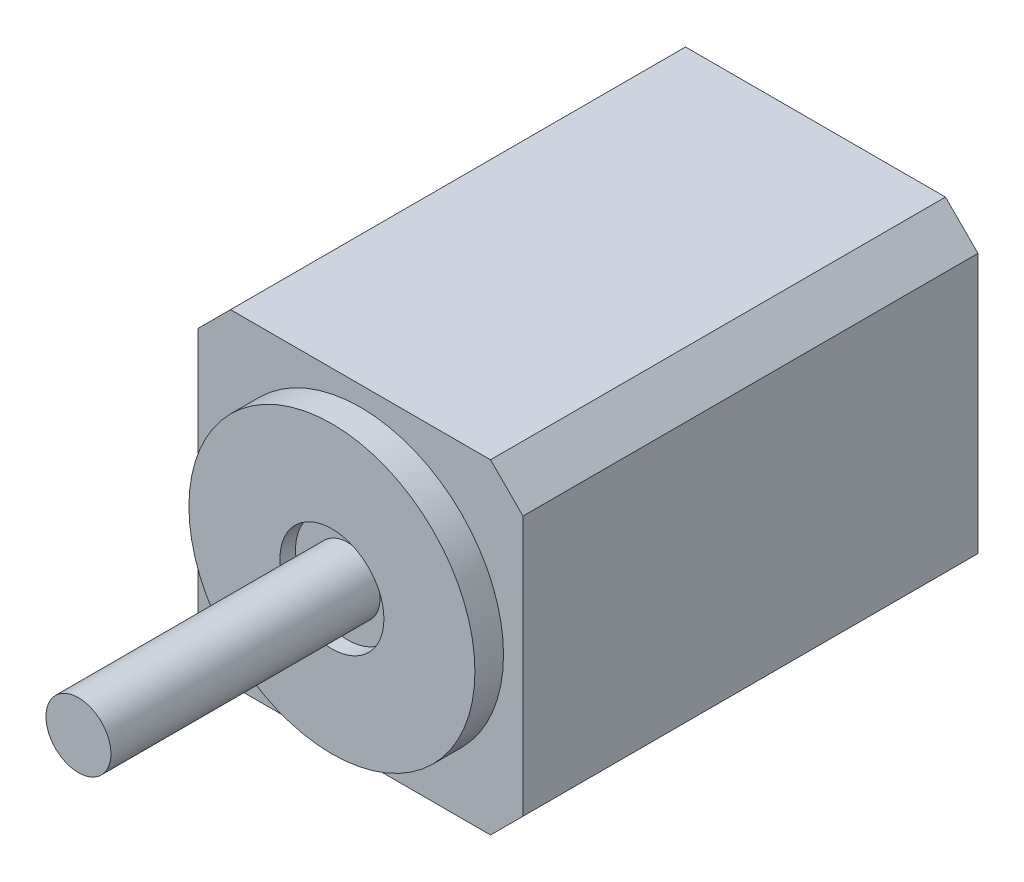
ISO-10303-21;
HEADER;
FILE_DESCRIPTION(('STEP AP214'),'2;1');
FILE_NAME('part.step','',(''),(''),'','','');
FILE_SCHEMA(('AUTOMOTIVE_DESIGN { 1 0 10303 214 1 1 1 1 }'));
ENDSEC;
DATA;
#1=APPLICATION_CONTEXT('core data for automotive mechanical design processes');
#2=APPLICATION_PROTOCOL_DEFINITION('international standard','automotive_design',2000,#1);
#3=PRODUCT_CONTEXT('',#1,'mechanical');
#4=PRODUCT('Part','Part','',(#3));
#5=PRODUCT_RELATED_PRODUCT_CATEGORY('part','',(#4));
#6=PRODUCT_DEFINITION_FORMATION('','',#4);
#7=PRODUCT_DEFINITION_CONTEXT('part definition',#1,'design');
#8=PRODUCT_DEFINITION('design','',#6,#7);
#9=PRODUCT_DEFINITION_SHAPE('','',#8);
#10=(LENGTH_UNIT() NAMED_UNIT(*) SI_UNIT(.MILLI.,.METRE.));
#11=(NAMED_UNIT(*) PLANE_ANGLE_UNIT() SI_UNIT($,.RADIAN.));
#12=(NAMED_UNIT(*) SI_UNIT($,.STERADIAN.) SOLID_ANGLE_UNIT());
#13=UNCERTAINTY_MEASURE_WITH_UNIT(LENGTH_MEASURE(1.E-05),#10,'distance_accuracy_value','');
#14=(GEOMETRIC_REPRESENTATION_CONTEXT(3) GLOBAL_UNCERTAINTY_ASSIGNED_CONTEXT((#13)) GLOBAL_UNIT_ASSIGNED_CONTEXT((#10,
#11,#12)) REPRESENTATION_CONTEXT('',''));
#15=CARTESIAN_POINT('',(0.,0.,0.));
#16=DIRECTION('',(0.,0.,1.));
#17=DIRECTION('',(1.,0.,0.));
#18=AXIS2_PLACEMENT_3D('',#15,#16,#17);
#19=CARTESIAN_POINT('',(12.5,-12.5,35.));
#20=DIRECTION('',(-1.,0.,0.));
#21=DIRECTION('',(0.,0.,1.));
#22=AXIS2_PLACEMENT_3D('',#19,#20,#21);
#23=PLANE('',#22);
#24=DIRECTION('',(0.,1.,0.));
#25=VECTOR('',#24,1.);
#26=CARTESIAN_POINT('',(12.5,-12.5,35.));
#27=LINE('',#26,#25);
#28=CARTESIAN_POINT('',(12.5,-10.,35.));
#29=VERTEX_POINT('',#28);
#30=CARTESIAN_POINT('',(12.5,10.,35.));
#31=VERTEX_POINT('',#30);
#32=EDGE_CURVE('E124',#29,#31,#27,.T.);
#33=ORIENTED_EDGE('',*,*,#32,.F.);
#34=DIRECTION('',(0.,0.,-1.));
#35=VECTOR('',#34,1.);
#36=CARTESIAN_POINT('',(12.5,-10.,35.));
#37=LINE('',#36,#35);
#38=CARTESIAN_POINT('',(12.5,-10.,0.));
#39=VERTEX_POINT('',#38);
#40=EDGE_CURVE('E151',#29,#39,#37,.T.);
#41=ORIENTED_EDGE('',*,*,#40,.T.);
#42=DIRECTION('',(0.,1.,0.));
#43=VECTOR('',#42,1.);
#44=CARTESIAN_POINT('',(12.5,-12.5,0.));
#45=LINE('',#44,#43);
#46=CARTESIAN_POINT('',(12.5,10.,0.));
#47=VERTEX_POINT('',#46);
#48=EDGE_CURVE('E157',#39,#47,#45,.T.);
#49=ORIENTED_EDGE('',*,*,#48,.T.);
#50=DIRECTION('',(0.,0.,1.));
#51=VECTOR('',#50,1.);
#52=CARTESIAN_POINT('',(12.5,10.,35.));
#53=LINE('',#52,#51);
#54=EDGE_CURVE('E149',#47,#31,#53,.T.);
#55=ORIENTED_EDGE('',*,*,#54,.T.);
#56=EDGE_LOOP('',(#33,#41,#49,#55));
#57=FACE_BOUND('',#56,.T.);
#58=ADVANCED_FACE('F32',(#57),#23,.F.);
#59=CARTESIAN_POINT('',(-12.5,12.5,35.));
#60=DIRECTION('',(0.,-1.,0.));
#61=DIRECTION('',(0.,0.,-1.));
#62=AXIS2_PLACEMENT_3D('',#59,#60,#61);
#63=PLANE('',#62);
#64=DIRECTION('',(-1.,0.,0.));
#65=VECTOR('',#64,1.);
#66=CARTESIAN_POINT('',(-12.5,12.5,35.));
#67=LINE('',#66,#65);
#68=CARTESIAN_POINT('',(10.,12.5,35.));
#69=VERTEX_POINT('',#68);
#70=CARTESIAN_POINT('',(-10.,12.5,35.));
#71=VERTEX_POINT('',#70);
#72=EDGE_CURVE('E127',#69,#71,#67,.T.);
#73=ORIENTED_EDGE('',*,*,#72,.F.);
#74=DIRECTION('',(0.,0.,-1.));
#75=VECTOR('',#74,1.);
#76=CARTESIAN_POINT('',(10.,12.5,35.));
#77=LINE('',#76,#75);
#78=CARTESIAN_POINT('',(10.,12.5,0.));
#79=VERTEX_POINT('',#78);
#80=EDGE_CURVE('E11',#69,#79,#77,.T.);
#81=ORIENTED_EDGE('',*,*,#80,.T.);
#82=DIRECTION('',(-1.,0.,0.));
#83=VECTOR('',#82,1.);
#84=CARTESIAN_POINT('',(-12.5,12.5,0.));
#85=LINE('',#84,#83);
#86=CARTESIAN_POINT('',(-10.,12.5,0.));
#87=VERTEX_POINT('',#86);
#88=EDGE_CURVE('E129',#79,#87,#85,.T.);
#89=ORIENTED_EDGE('',*,*,#88,.T.);
#90=DIRECTION('',(0.,0.,1.));
#91=VECTOR('',#90,1.);
#92=CARTESIAN_POINT('',(-10.,12.5,35.));
#93=LINE('',#92,#91);
#94=EDGE_CURVE('E40',#87,#71,#93,.T.);
#95=ORIENTED_EDGE('',*,*,#94,.T.);
#96=EDGE_LOOP('',(#73,#81,#89,#95));
#97=FACE_BOUND('',#96,.T.);
#98=ADVANCED_FACE('F228',(#97),#63,.F.);
#99=CARTESIAN_POINT('',(-12.5,-12.5,35.));
#100=DIRECTION('',(1.,0.,0.));
#101=DIRECTION('',(0.,0.,-1.));
#102=AXIS2_PLACEMENT_3D('',#99,#100,#101);
#103=PLANE('',#102);
#104=DIRECTION('',(0.,-1.,0.));
#105=VECTOR('',#104,1.);
#106=CARTESIAN_POINT('',(-12.5,-12.5,0.));
#107=LINE('',#106,#105);
#108=CARTESIAN_POINT('',(-12.5,10.,0.));
#109=VERTEX_POINT('',#108);
#110=CARTESIAN_POINT('',(-12.5,-10.,0.));
#111=VERTEX_POINT('',#110);
#112=EDGE_CURVE('E125',#109,#111,#107,.T.);
#113=ORIENTED_EDGE('',*,*,#112,.T.);
#114=DIRECTION('',(0.,0.,1.));
#115=VECTOR('',#114,1.);
#116=CARTESIAN_POINT('',(-12.5,-10.,35.));
#117=LINE('',#116,#115);
#118=CARTESIAN_POINT('',(-12.5,-10.,35.));
#119=VERTEX_POINT('',#118);
#120=EDGE_CURVE('E103',#111,#119,#117,.T.);
#121=ORIENTED_EDGE('',*,*,#120,.T.);
#122=DIRECTION('',(0.,-1.,0.));
#123=VECTOR('',#122,1.);
#124=CARTESIAN_POINT('',(-12.5,-12.5,35.));
#125=LINE('',#124,#123);
#126=CARTESIAN_POINT('',(-12.5,10.,35.));
#127=VERTEX_POINT('',#126);
#128=EDGE_CURVE('E169',#127,#119,#125,.T.);
#129=ORIENTED_EDGE('',*,*,#128,.F.);
#130=DIRECTION('',(0.,0.,-1.));
#131=VECTOR('',#130,1.);
#132=CARTESIAN_POINT('',(-12.5,10.,35.));
#133=LINE('',#132,#131);
#134=EDGE_CURVE('E108',#127,#109,#133,.T.);
#135=ORIENTED_EDGE('',*,*,#134,.T.);
#136=EDGE_LOOP('',(#113,#121,#129,#135));
#137=FACE_BOUND('',#136,.T.);
#138=ADVANCED_FACE('F226',(#137),#103,.F.);
#139=CARTESIAN_POINT('',(-12.5,-12.5,35.));
#140=DIRECTION('',(0.,1.,0.));
#141=DIRECTION('',(0.,0.,1.));
#142=AXIS2_PLACEMENT_3D('',#139,#140,#141);
#143=PLANE('',#142);
#144=DIRECTION('',(1.,0.,0.));
#145=VECTOR('',#144,1.);
#146=CARTESIAN_POINT('',(-12.5,-12.5,35.));
#147=LINE('',#146,#145);
#148=CARTESIAN_POINT('',(-10.,-12.5,35.));
#149=VERTEX_POINT('',#148);
#150=CARTESIAN_POINT('',(10.,-12.5,35.));
#151=VERTEX_POINT('',#150);
#152=EDGE_CURVE('E118',#149,#151,#147,.T.);
#153=ORIENTED_EDGE('',*,*,#152,.F.);
#154=DIRECTION('',(0.,0.,-1.));
#155=VECTOR('',#154,1.);
#156=CARTESIAN_POINT('',(-10.,-12.5,35.));
#157=LINE('',#156,#155);
#158=CARTESIAN_POINT('',(-10.,-12.5,0.));
#159=VERTEX_POINT('',#158);
#160=EDGE_CURVE('E102',#149,#159,#157,.T.);
#161=ORIENTED_EDGE('',*,*,#160,.T.);
#162=DIRECTION('',(1.,0.,0.));
#163=VECTOR('',#162,1.);
#164=CARTESIAN_POINT('',(-12.5,-12.5,0.));
#165=LINE('',#164,#163);
#166=CARTESIAN_POINT('',(10.,-12.5,0.));
#167=VERTEX_POINT('',#166);
#168=EDGE_CURVE('E115',#159,#167,#165,.T.);
#169=ORIENTED_EDGE('',*,*,#168,.T.);
#170=DIRECTION('',(0.,0.,1.));
#171=VECTOR('',#170,1.);
#172=CARTESIAN_POINT('',(10.,-12.5,35.));
#173=LINE('',#172,#171);
#174=EDGE_CURVE('E120',#167,#151,#173,.T.);
#175=ORIENTED_EDGE('',*,*,#174,.T.);
#176=EDGE_LOOP('',(#153,#161,#169,#175));
#177=FACE_BOUND('',#176,.T.);
#178=ADVANCED_FACE('F114',(#177),#143,.F.);
#179=CARTESIAN_POINT('',(0.,0.,35.));
#180=DIRECTION('',(0.,0.,-1.));
#181=DIRECTION('',(-1.,0.,0.));
#182=AXIS2_PLACEMENT_3D('',#179,#180,#181);
#183=PLANE('',#182);
#184=CARTESIAN_POINT('',(0.,0.,35.));
#185=DIRECTION('',(0.,0.,1.));
#186=DIRECTION('',(1.,0.,0.));
#187=AXIS2_PLACEMENT_3D('',#184,#185,#186);
#188=CIRCLE('',#187,11.);
#189=CARTESIAN_POINT('',(11.,0.,35.));
#190=VERTEX_POINT('',#189);
#191=EDGE_CURVE('E133',#190,#190,#188,.T.);
#192=ORIENTED_EDGE('',*,*,#191,.F.);
#193=EDGE_LOOP('',(#192));
#194=FACE_BOUND('',#193,.T.);
#195=ORIENTED_EDGE('',*,*,#128,.T.);
#196=DIRECTION('',(-0.707106781186547,0.707106781186549,0.));
#197=VECTOR('',#196,1.);
#198=CARTESIAN_POINT('',(-10.,-12.5,35.));
#199=LINE('',#198,#197);
#200=EDGE_CURVE('E147',#119,#149,#199,.F.);
#201=ORIENTED_EDGE('',*,*,#200,.T.);
#202=ORIENTED_EDGE('',*,*,#152,.T.);
#203=DIRECTION('',(-0.707106781186549,-0.707106781186547,0.));
#204=VECTOR('',#203,1.);
#205=CARTESIAN_POINT('',(12.5,-10.,35.));
#206=LINE('',#205,#204);
#207=EDGE_CURVE('E145',#151,#29,#206,.F.);
#208=ORIENTED_EDGE('',*,*,#207,.T.);
#209=ORIENTED_EDGE('',*,*,#32,.T.);
#210=DIRECTION('',(0.707106781186547,-0.707106781186549,0.));
#211=VECTOR('',#210,1.);
#212=CARTESIAN_POINT('',(10.,12.5,35.));
#213=LINE('',#212,#211);
#214=EDGE_CURVE('E53',#31,#69,#213,.F.);
#215=ORIENTED_EDGE('',*,*,#214,.T.);
#216=ORIENTED_EDGE('',*,*,#72,.T.);
#217=DIRECTION('',(0.707106781186549,0.707106781186547,0.));
#218=VECTOR('',#217,1.);
#219=CARTESIAN_POINT('',(-12.5,10.,35.));
#220=LINE('',#219,#218);
#221=EDGE_CURVE('E142',#71,#127,#220,.F.);
#222=ORIENTED_EDGE('',*,*,#221,.T.);
#223=EDGE_LOOP('',(#195,#201,#202,#208,#209,#215,#216,#222));
#224=FACE_BOUND('',#223,.T.);
#225=ADVANCED_FACE('F219',(#194,#224),#183,.F.);
#226=CARTESIAN_POINT('',(0.,0.,0.));
#227=DIRECTION('',(0.,0.,-1.));
#228=DIRECTION('',(-1.,0.,0.));
#229=AXIS2_PLACEMENT_3D('',#226,#227,#228);
#230=PLANE('',#229);
#231=ORIENTED_EDGE('',*,*,#168,.F.);
#232=DIRECTION('',(0.707106781186547,-0.707106781186549,0.));
#233=VECTOR('',#232,1.);
#234=CARTESIAN_POINT('',(-11.25,-11.25,0.));
#235=LINE('',#234,#233);
#236=EDGE_CURVE('E98',#159,#111,#235,.F.);
#237=ORIENTED_EDGE('',*,*,#236,.T.);
#238=ORIENTED_EDGE('',*,*,#112,.F.);
#239=DIRECTION('',(-0.707106781186549,-0.707106781186547,0.));
#240=VECTOR('',#239,1.);
#241=CARTESIAN_POINT('',(-11.25,11.25,0.));
#242=LINE('',#241,#240);
#243=EDGE_CURVE('E119',#109,#87,#242,.F.);
#244=ORIENTED_EDGE('',*,*,#243,.T.);
#245=ORIENTED_EDGE('',*,*,#88,.F.);
#246=DIRECTION('',(-0.707106781186547,0.707106781186549,0.));
#247=VECTOR('',#246,1.);
#248=CARTESIAN_POINT('',(11.25,11.25,0.));
#249=LINE('',#248,#247);
#250=EDGE_CURVE('E136',#79,#47,#249,.F.);
#251=ORIENTED_EDGE('',*,*,#250,.T.);
#252=ORIENTED_EDGE('',*,*,#48,.F.);
#253=DIRECTION('',(0.707106781186549,0.707106781186547,0.));
#254=VECTOR('',#253,1.);
#255=CARTESIAN_POINT('',(11.25,-11.25,0.));
#256=LINE('',#255,#254);
#257=EDGE_CURVE('E109',#39,#167,#256,.F.);
#258=ORIENTED_EDGE('',*,*,#257,.T.);
#259=EDGE_LOOP('',(#231,#237,#238,#244,#245,#251,#252,#258));
#260=FACE_BOUND('',#259,.T.);
#261=ADVANCED_FACE('F122',(#260),#230,.T.);
#262=CARTESIAN_POINT('',(0.,0.,37.2));
#263=DIRECTION('',(0.,0.,-1.));
#264=DIRECTION('',(-1.,0.,0.));
#265=AXIS2_PLACEMENT_3D('',#262,#263,#264);
#266=CYLINDRICAL_SURFACE('',#265,11.);
#267=CARTESIAN_POINT('',(0.,0.,37.2));
#268=DIRECTION('',(0.,0.,1.));
#269=DIRECTION('',(1.,0.,0.));
#270=AXIS2_PLACEMENT_3D('',#267,#268,#269);
#271=CIRCLE('',#270,11.);
#272=CARTESIAN_POINT('',(11.,0.,37.2));
#273=VERTEX_POINT('',#272);
#274=EDGE_CURVE('E162',#273,#273,#271,.T.);
#275=ORIENTED_EDGE('',*,*,#274,.F.);
#276=EDGE_LOOP('',(#275));
#277=FACE_BOUND('',#276,.T.);
#278=ORIENTED_EDGE('',*,*,#191,.T.);
#279=EDGE_LOOP('',(#278));
#280=FACE_BOUND('',#279,.T.);
#281=ADVANCED_FACE('F210',(#277,#280),#266,.T.);
#282=CARTESIAN_POINT('',(0.,0.,37.2));
#283=DIRECTION('',(0.,0.,1.));
#284=DIRECTION('',(1.,0.,0.));
#285=AXIS2_PLACEMENT_3D('',#282,#283,#284);
#286=PLANE('',#285);
#287=CARTESIAN_POINT('',(0.,0.,37.2));
#288=DIRECTION('',(0.,0.,1.));
#289=DIRECTION('',(1.,0.,0.));
#290=AXIS2_PLACEMENT_3D('',#287,#288,#289);
#291=CIRCLE('',#290,4.);
#292=CARTESIAN_POINT('',(4.,0.,37.2));
#293=VERTEX_POINT('',#292);
#294=EDGE_CURVE('E175',#293,#293,#291,.T.);
#295=ORIENTED_EDGE('',*,*,#294,.F.);
#296=EDGE_LOOP('',(#295));
#297=FACE_BOUND('',#296,.T.);
#298=ORIENTED_EDGE('',*,*,#274,.T.);
#299=EDGE_LOOP('',(#298));
#300=FACE_BOUND('',#299,.T.);
#301=ADVANCED_FACE('F207',(#297,#300),#286,.T.);
#302=CARTESIAN_POINT('',(-10.,-12.5,35.));
#303=DIRECTION('',(0.707106781186548,0.707106781186546,0.));
#304=DIRECTION('',(0.,0.,-1.));
#305=AXIS2_PLACEMENT_3D('',#302,#303,#304);
#306=PLANE('',#305);
#307=ORIENTED_EDGE('',*,*,#200,.F.);
#308=ORIENTED_EDGE('',*,*,#120,.F.);
#309=ORIENTED_EDGE('',*,*,#236,.F.);
#310=ORIENTED_EDGE('',*,*,#160,.F.);
#311=EDGE_LOOP('',(#307,#308,#309,#310));
#312=FACE_BOUND('',#311,.T.);
#313=ADVANCED_FACE('F101',(#312),#306,.F.);
#314=CARTESIAN_POINT('',(12.5,-10.,35.));
#315=DIRECTION('',(-0.707106781186546,0.707106781186548,0.));
#316=DIRECTION('',(0.,0.,-1.));
#317=AXIS2_PLACEMENT_3D('',#314,#315,#316);
#318=PLANE('',#317);
#319=ORIENTED_EDGE('',*,*,#207,.F.);
#320=ORIENTED_EDGE('',*,*,#174,.F.);
#321=ORIENTED_EDGE('',*,*,#257,.F.);
#322=ORIENTED_EDGE('',*,*,#40,.F.);
#323=EDGE_LOOP('',(#319,#320,#321,#322));
#324=FACE_BOUND('',#323,.T.);
#325=ADVANCED_FACE('F232',(#324),#318,.F.);
#326=CARTESIAN_POINT('',(10.,12.5,35.));
#327=DIRECTION('',(-0.707106781186548,-0.707106781186546,0.));
#328=DIRECTION('',(0.,0.,-1.));
#329=AXIS2_PLACEMENT_3D('',#326,#327,#328);
#330=PLANE('',#329);
#331=ORIENTED_EDGE('',*,*,#214,.F.);
#332=ORIENTED_EDGE('',*,*,#54,.F.);
#333=ORIENTED_EDGE('',*,*,#250,.F.);
#334=ORIENTED_EDGE('',*,*,#80,.F.);
#335=EDGE_LOOP('',(#331,#332,#333,#334));
#336=FACE_BOUND('',#335,.T.);
#337=ADVANCED_FACE('F231',(#336),#330,.F.);
#338=CARTESIAN_POINT('',(-12.5,10.,35.));
#339=DIRECTION('',(0.707106781186546,-0.707106781186548,0.));
#340=DIRECTION('',(0.,0.,-1.));
#341=AXIS2_PLACEMENT_3D('',#338,#339,#340);
#342=PLANE('',#341);
#343=ORIENTED_EDGE('',*,*,#221,.F.);
#344=ORIENTED_EDGE('',*,*,#94,.F.);
#345=ORIENTED_EDGE('',*,*,#243,.F.);
#346=ORIENTED_EDGE('',*,*,#134,.F.);
#347=EDGE_LOOP('',(#343,#344,#345,#346));
#348=FACE_BOUND('',#347,.T.);
#349=ADVANCED_FACE('F34',(#348),#342,.F.);
#350=CARTESIAN_POINT('',(0.,0.,36.));
#351=DIRECTION('',(0.,0.,1.));
#352=DIRECTION('',(1.,0.,0.));
#353=AXIS2_PLACEMENT_3D('',#350,#351,#352);
#354=CYLINDRICAL_SURFACE('',#353,4.);
#355=CARTESIAN_POINT('',(0.,0.,36.));
#356=DIRECTION('',(0.,0.,1.));
#357=DIRECTION('',(1.,0.,0.));
#358=AXIS2_PLACEMENT_3D('',#355,#356,#357);
#359=CIRCLE('',#358,4.);
#360=CARTESIAN_POINT('',(4.,0.,36.));
#361=VERTEX_POINT('',#360);
#362=EDGE_CURVE('E165',#361,#361,#359,.T.);
#363=ORIENTED_EDGE('',*,*,#362,.F.);
#364=EDGE_LOOP('',(#363));
#365=FACE_BOUND('',#364,.T.);
#366=ORIENTED_EDGE('',*,*,#294,.T.);
#367=EDGE_LOOP('',(#366));
#368=FACE_BOUND('',#367,.T.);
#369=ADVANCED_FACE('F198',(#365,#368),#354,.F.);
#370=CARTESIAN_POINT('',(0.,0.,36.));
#371=DIRECTION('',(0.,0.,1.));
#372=DIRECTION('',(1.,0.,0.));
#373=AXIS2_PLACEMENT_3D('',#370,#371,#372);
#374=PLANE('',#373);
#375=CARTESIAN_POINT('',(0.,0.,36.));
#376=DIRECTION('',(0.,0.,1.));
#377=DIRECTION('',(1.,0.,0.));
#378=AXIS2_PLACEMENT_3D('',#375,#376,#377);
#379=CIRCLE('',#378,2.5);
#380=CARTESIAN_POINT('',(2.5,0.,36.));
#381=VERTEX_POINT('',#380);
#382=EDGE_CURVE('E181',#381,#381,#379,.T.);
#383=ORIENTED_EDGE('',*,*,#382,.F.);
#384=EDGE_LOOP('',(#383));
#385=FACE_BOUND('',#384,.T.);
#386=ORIENTED_EDGE('',*,*,#362,.T.);
#387=EDGE_LOOP('',(#386));
#388=FACE_BOUND('',#387,.T.);
#389=ADVANCED_FACE('F192',(#385,#388),#374,.T.);
#390=CARTESIAN_POINT('',(0.,0.,56.7));
#391=DIRECTION('',(0.,0.,-1.));
#392=DIRECTION('',(-1.,0.,0.));
#393=AXIS2_PLACEMENT_3D('',#390,#391,#392);
#394=CYLINDRICAL_SURFACE('',#393,2.5);
#395=CARTESIAN_POINT('',(0.,0.,56.7));
#396=DIRECTION('',(0.,0.,1.));
#397=DIRECTION('',(1.,0.,0.));
#398=AXIS2_PLACEMENT_3D('',#395,#396,#397);
#399=CIRCLE('',#398,2.5);
#400=CARTESIAN_POINT('',(2.5,0.,56.7));
#401=VERTEX_POINT('',#400);
#402=EDGE_CURVE('E178',#401,#401,#399,.T.);
#403=ORIENTED_EDGE('',*,*,#402,.F.);
#404=EDGE_LOOP('',(#403));
#405=FACE_BOUND('',#404,.T.);
#406=ORIENTED_EDGE('',*,*,#382,.T.);
#407=EDGE_LOOP('',(#406));
#408=FACE_BOUND('',#407,.T.);
#409=ADVANCED_FACE('F189',(#405,#408),#394,.T.);
#410=CARTESIAN_POINT('',(0.,0.,56.7));
#411=DIRECTION('',(0.,0.,1.));
#412=DIRECTION('',(1.,0.,0.));
#413=AXIS2_PLACEMENT_3D('',#410,#411,#412);
#414=PLANE('',#413);
#415=ORIENTED_EDGE('',*,*,#402,.T.);
#416=EDGE_LOOP('',(#415));
#417=FACE_BOUND('',#416,.T.);
#418=ADVANCED_FACE('F187',(#417),#414,.T.);
#419=CLOSED_SHELL('',(#58,#98,#138,#178,#225,#261,#281,#301,#313,#325,#337,#349,#369,#389,#409,#418));
#420=MANIFOLD_SOLID_BREP('B2',#419);
#421=ADVANCED_BREP_SHAPE_REPRESENTATION('',(#18,#420),#14);
#422=SHAPE_DEFINITION_REPRESENTATION(#9,#421);
ENDSEC;
END-ISO-10303-21;
